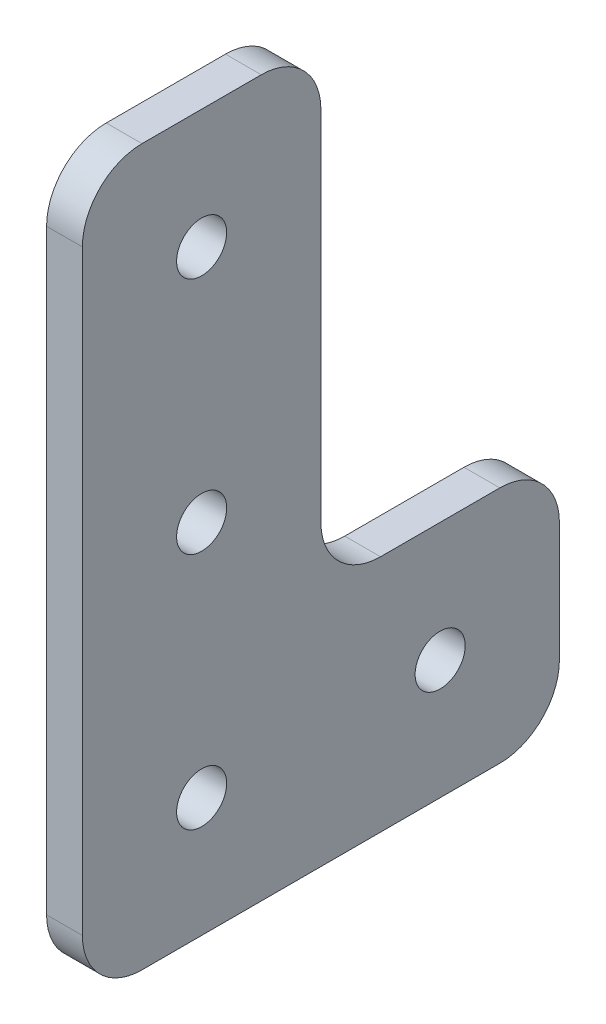
ISO-10303-21;
HEADER;
FILE_DESCRIPTION(('STEP AP214'),'2;1');
FILE_NAME('part.step','',(''),(''),'','','');
FILE_SCHEMA(('AUTOMOTIVE_DESIGN { 1 0 10303 214 1 1 1 1 }'));
ENDSEC;
DATA;
#1=APPLICATION_CONTEXT('core data for automotive mechanical design processes');
#2=APPLICATION_PROTOCOL_DEFINITION('international standard','automotive_design',2000,#1);
#3=PRODUCT_CONTEXT('',#1,'mechanical');
#4=PRODUCT('Part','Part','',(#3));
#5=PRODUCT_RELATED_PRODUCT_CATEGORY('part','',(#4));
#6=PRODUCT_DEFINITION_FORMATION('','',#4);
#7=PRODUCT_DEFINITION_CONTEXT('part definition',#1,'design');
#8=PRODUCT_DEFINITION('design','',#6,#7);
#9=PRODUCT_DEFINITION_SHAPE('','',#8);
#10=(LENGTH_UNIT() NAMED_UNIT(*) SI_UNIT(.MILLI.,.METRE.));
#11=(NAMED_UNIT(*) PLANE_ANGLE_UNIT() SI_UNIT($,.RADIAN.));
#12=(NAMED_UNIT(*) SI_UNIT($,.STERADIAN.) SOLID_ANGLE_UNIT());
#13=UNCERTAINTY_MEASURE_WITH_UNIT(LENGTH_MEASURE(1.E-05),#10,'distance_accuracy_value','');
#14=(GEOMETRIC_REPRESENTATION_CONTEXT(3) GLOBAL_UNCERTAINTY_ASSIGNED_CONTEXT((#13)) GLOBAL_UNIT_ASSIGNED_CONTEXT((#10,
#11,#12)) REPRESENTATION_CONTEXT('',''));
#15=CARTESIAN_POINT('',(0.,0.,0.));
#16=DIRECTION('',(0.,0.,1.));
#17=DIRECTION('',(1.,0.,0.));
#18=AXIS2_PLACEMENT_3D('',#15,#16,#17);
#19=CARTESIAN_POINT('',(3.,0.,0.));
#20=DIRECTION('',(1.,0.,0.));
#21=DIRECTION('',(0.,0.,-1.));
#22=AXIS2_PLACEMENT_3D('',#19,#20,#21);
#23=PLANE('',#22);
#24=CARTESIAN_POINT('',(3.,-20.,-4.18263190538858E-13));
#25=DIRECTION('',(1.,0.,0.));
#26=DIRECTION('',(0.,0.,-1.));
#27=AXIS2_PLACEMENT_3D('',#24,#25,#26);
#28=CIRCLE('',#27,2.1);
#29=CARTESIAN_POINT('',(3.,-20.,-2.10000000000042));
#30=VERTEX_POINT('',#29);
#31=EDGE_CURVE('E335',#30,#30,#28,.T.);
#32=ORIENTED_EDGE('',*,*,#31,.F.);
#33=EDGE_LOOP('',(#32));
#34=FACE_BOUND('',#33,.T.);
#35=CARTESIAN_POINT('',(3.,20.,0.));
#36=DIRECTION('',(1.,0.,0.));
#37=DIRECTION('',(0.,0.,-1.));
#38=AXIS2_PLACEMENT_3D('',#35,#36,#37);
#39=CIRCLE('',#38,2.1);
#40=CARTESIAN_POINT('',(3.,20.,-2.1));
#41=VERTEX_POINT('',#40);
#42=EDGE_CURVE('E269',#41,#41,#39,.T.);
#43=ORIENTED_EDGE('',*,*,#42,.F.);
#44=EDGE_LOOP('',(#43));
#45=FACE_BOUND('',#44,.T.);
#46=DIRECTION('',(0.,-1.,0.));
#47=VECTOR('',#46,1.);
#48=CARTESIAN_POINT('',(3.,30.,10.));
#49=LINE('',#48,#47);
#50=CARTESIAN_POINT('',(3.,25.,10.));
#51=VERTEX_POINT('',#50);
#52=CARTESIAN_POINT('',(3.,-25.,9.99999999999999));
#53=VERTEX_POINT('',#52);
#54=EDGE_CURVE('E171',#51,#53,#49,.T.);
#55=ORIENTED_EDGE('',*,*,#54,.T.);
#56=CARTESIAN_POINT('',(3.,-25.,5.));
#57=DIRECTION('',(1.,0.,0.));
#58=DIRECTION('',(0.,0.,-1.));
#59=AXIS2_PLACEMENT_3D('',#56,#57,#58);
#60=CIRCLE('',#59,5.);
#61=CARTESIAN_POINT('',(3.,-30.,5.));
#62=VERTEX_POINT('',#61);
#63=EDGE_CURVE('E199',#53,#62,#60,.T.);
#64=ORIENTED_EDGE('',*,*,#63,.T.);
#65=DIRECTION('',(0.,0.,-1.));
#66=VECTOR('',#65,1.);
#67=CARTESIAN_POINT('',(3.,-30.,-30.));
#68=LINE('',#67,#66);
#69=CARTESIAN_POINT('',(3.,-30.,-25.));
#70=VERTEX_POINT('',#69);
#71=EDGE_CURVE('E151',#62,#70,#68,.T.);
#72=ORIENTED_EDGE('',*,*,#71,.T.);
#73=CARTESIAN_POINT('',(3.,-25.,-25.));
#74=DIRECTION('',(1.,0.,0.));
#75=DIRECTION('',(0.,0.,-1.));
#76=AXIS2_PLACEMENT_3D('',#73,#74,#75);
#77=CIRCLE('',#76,5.);
#78=CARTESIAN_POINT('',(3.,-25.,-30.));
#79=VERTEX_POINT('',#78);
#80=EDGE_CURVE('E196',#70,#79,#77,.T.);
#81=ORIENTED_EDGE('',*,*,#80,.T.);
#82=DIRECTION('',(0.,1.,0.));
#83=VECTOR('',#82,1.);
#84=CARTESIAN_POINT('',(3.,-10.,-30.));
#85=LINE('',#84,#83);
#86=CARTESIAN_POINT('',(3.,-15.,-30.));
#87=VERTEX_POINT('',#86);
#88=EDGE_CURVE('E164',#79,#87,#85,.T.);
#89=ORIENTED_EDGE('',*,*,#88,.T.);
#90=CARTESIAN_POINT('',(3.,-15.,-25.));
#91=DIRECTION('',(1.,0.,0.));
#92=DIRECTION('',(0.,0.,-1.));
#93=AXIS2_PLACEMENT_3D('',#90,#91,#92);
#94=CIRCLE('',#93,5.);
#95=CARTESIAN_POINT('',(3.,-10.,-25.));
#96=VERTEX_POINT('',#95);
#97=EDGE_CURVE('E193',#87,#96,#94,.T.);
#98=ORIENTED_EDGE('',*,*,#97,.T.);
#99=DIRECTION('',(0.,0.,1.));
#100=VECTOR('',#99,1.);
#101=CARTESIAN_POINT('',(3.,-10.,-10.));
#102=LINE('',#101,#100);
#103=CARTESIAN_POINT('',(3.,-10.,-15.));
#104=VERTEX_POINT('',#103);
#105=EDGE_CURVE('E252',#96,#104,#102,.T.);
#106=ORIENTED_EDGE('',*,*,#105,.T.);
#107=CARTESIAN_POINT('',(3.,-5.,-15.));
#108=DIRECTION('',(1.,0.,0.));
#109=DIRECTION('',(0.,0.,-1.));
#110=AXIS2_PLACEMENT_3D('',#107,#108,#109);
#111=CIRCLE('',#110,5.);
#112=CARTESIAN_POINT('',(3.,-5.,-10.));
#113=VERTEX_POINT('',#112);
#114=EDGE_CURVE('E11',#104,#113,#111,.F.);
#115=ORIENTED_EDGE('',*,*,#114,.T.);
#116=DIRECTION('',(0.,1.,0.));
#117=VECTOR('',#116,1.);
#118=CARTESIAN_POINT('',(3.,30.,-10.));
#119=LINE('',#118,#117);
#120=CARTESIAN_POINT('',(3.,25.,-10.));
#121=VERTEX_POINT('',#120);
#122=EDGE_CURVE('E251',#113,#121,#119,.T.);
#123=ORIENTED_EDGE('',*,*,#122,.T.);
#124=CARTESIAN_POINT('',(3.,25.,-5.));
#125=DIRECTION('',(1.,0.,0.));
#126=DIRECTION('',(0.,0.,-1.));
#127=AXIS2_PLACEMENT_3D('',#124,#125,#126);
#128=CIRCLE('',#127,5.);
#129=CARTESIAN_POINT('',(3.,30.,-5.));
#130=VERTEX_POINT('',#129);
#131=EDGE_CURVE('E62',#121,#130,#128,.T.);
#132=ORIENTED_EDGE('',*,*,#131,.T.);
#133=DIRECTION('',(0.,0.,1.));
#134=VECTOR('',#133,1.);
#135=CARTESIAN_POINT('',(3.,30.,10.));
#136=LINE('',#135,#134);
#137=CARTESIAN_POINT('',(3.,30.,5.));
#138=VERTEX_POINT('',#137);
#139=EDGE_CURVE('E257',#130,#138,#136,.T.);
#140=ORIENTED_EDGE('',*,*,#139,.T.);
#141=CARTESIAN_POINT('',(3.,25.,5.));
#142=DIRECTION('',(1.,0.,0.));
#143=DIRECTION('',(0.,0.,-1.));
#144=AXIS2_PLACEMENT_3D('',#141,#142,#143);
#145=CIRCLE('',#144,5.);
#146=EDGE_CURVE('E188',#138,#51,#145,.T.);
#147=ORIENTED_EDGE('',*,*,#146,.T.);
#148=EDGE_LOOP('',(#55,#64,#72,#81,#89,#98,#106,#115,#123,#132,#140,#147));
#149=FACE_BOUND('',#148,.T.);
#150=CARTESIAN_POINT('',(3.,0.,-2.09998957007418E-13));
#151=DIRECTION('',(1.,0.,0.));
#152=DIRECTION('',(0.,0.,-1.));
#153=AXIS2_PLACEMENT_3D('',#150,#151,#152);
#154=CIRCLE('',#153,2.1);
#155=CARTESIAN_POINT('',(3.,0.,-2.10000000000021));
#156=VERTEX_POINT('',#155);
#157=EDGE_CURVE('E343',#156,#156,#154,.T.);
#158=ORIENTED_EDGE('',*,*,#157,.F.);
#159=EDGE_LOOP('',(#158));
#160=FACE_BOUND('',#159,.T.);
#161=CARTESIAN_POINT('',(3.,-20.,-20.0000000000004));
#162=DIRECTION('',(1.,0.,0.));
#163=DIRECTION('',(0.,0.,-1.));
#164=AXIS2_PLACEMENT_3D('',#161,#162,#163);
#165=CIRCLE('',#164,2.1);
#166=CARTESIAN_POINT('',(3.,-20.,-22.1000000000004));
#167=VERTEX_POINT('',#166);
#168=EDGE_CURVE('E324',#167,#167,#165,.T.);
#169=ORIENTED_EDGE('',*,*,#168,.F.);
#170=EDGE_LOOP('',(#169));
#171=FACE_BOUND('',#170,.T.);
#172=ADVANCED_FACE('F39',(#34,#45,#149,#160,#171),#23,.T.);
#173=CARTESIAN_POINT('',(0.,0.,0.));
#174=DIRECTION('',(1.,0.,0.));
#175=DIRECTION('',(0.,0.,-1.));
#176=AXIS2_PLACEMENT_3D('',#173,#174,#175);
#177=PLANE('',#176);
#178=DIRECTION('',(0.,0.,-1.));
#179=VECTOR('',#178,1.);
#180=CARTESIAN_POINT('',(0.,-30.,9.99999999999999));
#181=LINE('',#180,#179);
#182=CARTESIAN_POINT('',(0.,-30.,5.));
#183=VERTEX_POINT('',#182);
#184=CARTESIAN_POINT('',(0.,-30.,-25.));
#185=VERTEX_POINT('',#184);
#186=EDGE_CURVE('E148',#183,#185,#181,.T.);
#187=ORIENTED_EDGE('',*,*,#186,.F.);
#188=CARTESIAN_POINT('',(0.,-25.,5.));
#189=DIRECTION('',(1.,0.,0.));
#190=DIRECTION('',(0.,0.,-1.));
#191=AXIS2_PLACEMENT_3D('',#188,#189,#190);
#192=CIRCLE('',#191,5.);
#193=CARTESIAN_POINT('',(0.,-25.,9.99999999999999));
#194=VERTEX_POINT('',#193);
#195=EDGE_CURVE('E130',#183,#194,#192,.F.);
#196=ORIENTED_EDGE('',*,*,#195,.T.);
#197=DIRECTION('',(0.,-1.,0.));
#198=VECTOR('',#197,1.);
#199=CARTESIAN_POINT('',(0.,30.,10.));
#200=LINE('',#199,#198);
#201=CARTESIAN_POINT('',(0.,25.,10.));
#202=VERTEX_POINT('',#201);
#203=EDGE_CURVE('E160',#202,#194,#200,.T.);
#204=ORIENTED_EDGE('',*,*,#203,.F.);
#205=CARTESIAN_POINT('',(0.,25.,5.));
#206=DIRECTION('',(1.,0.,0.));
#207=DIRECTION('',(0.,0.,-1.));
#208=AXIS2_PLACEMENT_3D('',#205,#206,#207);
#209=CIRCLE('',#208,5.);
#210=CARTESIAN_POINT('',(0.,30.,5.));
#211=VERTEX_POINT('',#210);
#212=EDGE_CURVE('E153',#202,#211,#209,.F.);
#213=ORIENTED_EDGE('',*,*,#212,.T.);
#214=DIRECTION('',(0.,0.,1.));
#215=VECTOR('',#214,1.);
#216=CARTESIAN_POINT('',(0.,30.,10.));
#217=LINE('',#216,#215);
#218=CARTESIAN_POINT('',(0.,30.,-5.));
#219=VERTEX_POINT('',#218);
#220=EDGE_CURVE('E166',#219,#211,#217,.T.);
#221=ORIENTED_EDGE('',*,*,#220,.F.);
#222=CARTESIAN_POINT('',(0.,25.,-5.));
#223=DIRECTION('',(1.,0.,0.));
#224=DIRECTION('',(0.,0.,-1.));
#225=AXIS2_PLACEMENT_3D('',#222,#223,#224);
#226=CIRCLE('',#225,5.);
#227=CARTESIAN_POINT('',(0.,25.,-10.));
#228=VERTEX_POINT('',#227);
#229=EDGE_CURVE('E175',#219,#228,#226,.F.);
#230=ORIENTED_EDGE('',*,*,#229,.T.);
#231=DIRECTION('',(0.,1.,0.));
#232=VECTOR('',#231,1.);
#233=CARTESIAN_POINT('',(0.,30.,-10.));
#234=LINE('',#233,#232);
#235=CARTESIAN_POINT('',(0.,-5.,-10.));
#236=VERTEX_POINT('',#235);
#237=EDGE_CURVE('E234',#236,#228,#234,.T.);
#238=ORIENTED_EDGE('',*,*,#237,.F.);
#239=CARTESIAN_POINT('',(0.,-5.,-15.));
#240=DIRECTION('',(1.,0.,0.));
#241=DIRECTION('',(0.,0.,-1.));
#242=AXIS2_PLACEMENT_3D('',#239,#240,#241);
#243=CIRCLE('',#242,5.);
#244=CARTESIAN_POINT('',(0.,-10.,-15.));
#245=VERTEX_POINT('',#244);
#246=EDGE_CURVE('E48',#236,#245,#243,.T.);
#247=ORIENTED_EDGE('',*,*,#246,.T.);
#248=DIRECTION('',(0.,0.,1.));
#249=VECTOR('',#248,1.);
#250=CARTESIAN_POINT('',(0.,-10.,-10.));
#251=LINE('',#250,#249);
#252=CARTESIAN_POINT('',(0.,-10.,-25.));
#253=VERTEX_POINT('',#252);
#254=EDGE_CURVE('E232',#253,#245,#251,.T.);
#255=ORIENTED_EDGE('',*,*,#254,.F.);
#256=CARTESIAN_POINT('',(0.,-15.,-25.));
#257=DIRECTION('',(1.,0.,0.));
#258=DIRECTION('',(0.,0.,-1.));
#259=AXIS2_PLACEMENT_3D('',#256,#257,#258);
#260=CIRCLE('',#259,5.);
#261=CARTESIAN_POINT('',(0.,-15.,-30.));
#262=VERTEX_POINT('',#261);
#263=EDGE_CURVE('E178',#253,#262,#260,.F.);
#264=ORIENTED_EDGE('',*,*,#263,.T.);
#265=DIRECTION('',(0.,1.,0.));
#266=VECTOR('',#265,1.);
#267=CARTESIAN_POINT('',(0.,-10.,-30.));
#268=LINE('',#267,#266);
#269=CARTESIAN_POINT('',(0.,-25.,-30.));
#270=VERTEX_POINT('',#269);
#271=EDGE_CURVE('E244',#270,#262,#268,.T.);
#272=ORIENTED_EDGE('',*,*,#271,.F.);
#273=CARTESIAN_POINT('',(0.,-25.,-25.));
#274=DIRECTION('',(1.,0.,0.));
#275=DIRECTION('',(0.,0.,-1.));
#276=AXIS2_PLACEMENT_3D('',#273,#274,#275);
#277=CIRCLE('',#276,5.);
#278=EDGE_CURVE('E142',#270,#185,#277,.F.);
#279=ORIENTED_EDGE('',*,*,#278,.T.);
#280=EDGE_LOOP('',(#187,#196,#204,#213,#221,#230,#238,#247,#255,#264,#272,#279));
#281=FACE_BOUND('',#280,.T.);
#282=CARTESIAN_POINT('',(0.,20.,0.));
#283=DIRECTION('',(1.,0.,0.));
#284=DIRECTION('',(0.,0.,-1.));
#285=AXIS2_PLACEMENT_3D('',#282,#283,#284);
#286=CIRCLE('',#285,2.1);
#287=CARTESIAN_POINT('',(0.,20.,-2.1));
#288=VERTEX_POINT('',#287);
#289=EDGE_CURVE('E347',#288,#288,#286,.T.);
#290=ORIENTED_EDGE('',*,*,#289,.T.);
#291=EDGE_LOOP('',(#290));
#292=FACE_BOUND('',#291,.T.);
#293=CARTESIAN_POINT('',(0.,0.,-2.09998957007418E-13));
#294=DIRECTION('',(1.,0.,0.));
#295=DIRECTION('',(0.,0.,-1.));
#296=AXIS2_PLACEMENT_3D('',#293,#294,#295);
#297=CIRCLE('',#296,2.1);
#298=CARTESIAN_POINT('',(0.,0.,-2.10000000000021));
#299=VERTEX_POINT('',#298);
#300=EDGE_CURVE('E339',#299,#299,#297,.T.);
#301=ORIENTED_EDGE('',*,*,#300,.T.);
#302=EDGE_LOOP('',(#301));
#303=FACE_BOUND('',#302,.T.);
#304=CARTESIAN_POINT('',(0.,-20.,-4.18263190538858E-13));
#305=DIRECTION('',(1.,0.,0.));
#306=DIRECTION('',(0.,0.,-1.));
#307=AXIS2_PLACEMENT_3D('',#304,#305,#306);
#308=CIRCLE('',#307,2.1);
#309=CARTESIAN_POINT('',(0.,-20.,-2.10000000000042));
#310=VERTEX_POINT('',#309);
#311=EDGE_CURVE('E332',#310,#310,#308,.T.);
#312=ORIENTED_EDGE('',*,*,#311,.T.);
#313=EDGE_LOOP('',(#312));
#314=FACE_BOUND('',#313,.T.);
#315=CARTESIAN_POINT('',(0.,-20.,-20.0000000000004));
#316=DIRECTION('',(1.,0.,0.));
#317=DIRECTION('',(0.,0.,-1.));
#318=AXIS2_PLACEMENT_3D('',#315,#316,#317);
#319=CIRCLE('',#318,2.1);
#320=CARTESIAN_POINT('',(0.,-20.,-22.1000000000004));
#321=VERTEX_POINT('',#320);
#322=EDGE_CURVE('E327',#321,#321,#319,.T.);
#323=ORIENTED_EDGE('',*,*,#322,.T.);
#324=EDGE_LOOP('',(#323));
#325=FACE_BOUND('',#324,.T.);
#326=ADVANCED_FACE('F156',(#281,#292,#303,#314,#325),#177,.F.);
#327=CARTESIAN_POINT('',(3.,-10.,-30.));
#328=DIRECTION('',(0.,0.,1.));
#329=DIRECTION('',(0.,-1.,0.));
#330=AXIS2_PLACEMENT_3D('',#327,#328,#329);
#331=PLANE('',#330);
#332=ORIENTED_EDGE('',*,*,#88,.F.);
#333=DIRECTION('',(-1.,0.,0.));
#334=VECTOR('',#333,1.);
#335=CARTESIAN_POINT('',(3.,-25.,-30.));
#336=LINE('',#335,#334);
#337=EDGE_CURVE('E205',#79,#270,#336,.T.);
#338=ORIENTED_EDGE('',*,*,#337,.T.);
#339=ORIENTED_EDGE('',*,*,#271,.T.);
#340=DIRECTION('',(-1.,0.,0.));
#341=VECTOR('',#340,1.);
#342=CARTESIAN_POINT('',(3.,-15.,-30.));
#343=LINE('',#342,#341);
#344=EDGE_CURVE('E202',#262,#87,#343,.F.);
#345=ORIENTED_EDGE('',*,*,#344,.T.);
#346=EDGE_LOOP('',(#332,#338,#339,#345));
#347=FACE_BOUND('',#346,.T.);
#348=ADVANCED_FACE('F297',(#347),#331,.F.);
#349=CARTESIAN_POINT('',(3.,-10.,-10.));
#350=DIRECTION('',(0.,-1.,0.));
#351=DIRECTION('',(0.,0.,-1.));
#352=AXIS2_PLACEMENT_3D('',#349,#350,#351);
#353=PLANE('',#352);
#354=ORIENTED_EDGE('',*,*,#105,.F.);
#355=DIRECTION('',(-1.,0.,0.));
#356=VECTOR('',#355,1.);
#357=CARTESIAN_POINT('',(3.,-10.,-25.));
#358=LINE('',#357,#356);
#359=EDGE_CURVE('E212',#96,#253,#358,.T.);
#360=ORIENTED_EDGE('',*,*,#359,.T.);
#361=ORIENTED_EDGE('',*,*,#254,.T.);
#362=DIRECTION('',(-1.,0.,0.));
#363=VECTOR('',#362,1.);
#364=CARTESIAN_POINT('',(3.,-10.,-15.));
#365=LINE('',#364,#363);
#366=EDGE_CURVE('E209',#245,#104,#365,.F.);
#367=ORIENTED_EDGE('',*,*,#366,.T.);
#368=EDGE_LOOP('',(#354,#360,#361,#367));
#369=FACE_BOUND('',#368,.T.);
#370=ADVANCED_FACE('F240',(#369),#353,.F.);
#371=CARTESIAN_POINT('',(3.,30.,-10.));
#372=DIRECTION('',(0.,0.,1.));
#373=DIRECTION('',(0.,-1.,0.));
#374=AXIS2_PLACEMENT_3D('',#371,#372,#373);
#375=PLANE('',#374);
#376=ORIENTED_EDGE('',*,*,#122,.F.);
#377=DIRECTION('',(-1.,0.,0.));
#378=VECTOR('',#377,1.);
#379=CARTESIAN_POINT('',(0.,-5.,-10.));
#380=LINE('',#379,#378);
#381=EDGE_CURVE('E219',#113,#236,#380,.T.);
#382=ORIENTED_EDGE('',*,*,#381,.T.);
#383=ORIENTED_EDGE('',*,*,#237,.T.);
#384=DIRECTION('',(-1.,0.,0.));
#385=VECTOR('',#384,1.);
#386=CARTESIAN_POINT('',(3.,25.,-10.));
#387=LINE('',#386,#385);
#388=EDGE_CURVE('E216',#228,#121,#387,.F.);
#389=ORIENTED_EDGE('',*,*,#388,.T.);
#390=EDGE_LOOP('',(#376,#382,#383,#389));
#391=FACE_BOUND('',#390,.T.);
#392=ADVANCED_FACE('F254',(#391),#375,.F.);
#393=CARTESIAN_POINT('',(3.,30.,10.));
#394=DIRECTION('',(0.,-1.,0.));
#395=DIRECTION('',(0.,0.,-1.));
#396=AXIS2_PLACEMENT_3D('',#393,#394,#395);
#397=PLANE('',#396);
#398=ORIENTED_EDGE('',*,*,#139,.F.);
#399=DIRECTION('',(-1.,0.,0.));
#400=VECTOR('',#399,1.);
#401=CARTESIAN_POINT('',(3.,30.,-5.));
#402=LINE('',#401,#400);
#403=EDGE_CURVE('E225',#130,#219,#402,.T.);
#404=ORIENTED_EDGE('',*,*,#403,.T.);
#405=ORIENTED_EDGE('',*,*,#220,.T.);
#406=DIRECTION('',(-1.,0.,0.));
#407=VECTOR('',#406,1.);
#408=CARTESIAN_POINT('',(3.,30.,5.));
#409=LINE('',#408,#407);
#410=EDGE_CURVE('E55',#211,#138,#409,.F.);
#411=ORIENTED_EDGE('',*,*,#410,.T.);
#412=EDGE_LOOP('',(#398,#404,#405,#411));
#413=FACE_BOUND('',#412,.T.);
#414=ADVANCED_FACE('F274',(#413),#397,.F.);
#415=CARTESIAN_POINT('',(3.,30.,10.));
#416=DIRECTION('',(0.,0.,-1.));
#417=DIRECTION('',(0.,1.,0.));
#418=AXIS2_PLACEMENT_3D('',#415,#416,#417);
#419=PLANE('',#418);
#420=ORIENTED_EDGE('',*,*,#203,.T.);
#421=DIRECTION('',(-1.,0.,0.));
#422=VECTOR('',#421,1.);
#423=CARTESIAN_POINT('',(3.,-25.,9.99999999999999));
#424=LINE('',#423,#422);
#425=EDGE_CURVE('E135',#194,#53,#424,.F.);
#426=ORIENTED_EDGE('',*,*,#425,.T.);
#427=ORIENTED_EDGE('',*,*,#54,.F.);
#428=DIRECTION('',(-1.,0.,0.));
#429=VECTOR('',#428,1.);
#430=CARTESIAN_POINT('',(3.,25.,10.));
#431=LINE('',#430,#429);
#432=EDGE_CURVE('E141',#51,#202,#431,.T.);
#433=ORIENTED_EDGE('',*,*,#432,.T.);
#434=EDGE_LOOP('',(#420,#426,#427,#433));
#435=FACE_BOUND('',#434,.T.);
#436=ADVANCED_FACE('F281',(#435),#419,.F.);
#437=CARTESIAN_POINT('',(3.,-30.,9.99999999999999));
#438=DIRECTION('',(0.,1.,0.));
#439=DIRECTION('',(0.,0.,1.));
#440=AXIS2_PLACEMENT_3D('',#437,#438,#439);
#441=PLANE('',#440);
#442=ORIENTED_EDGE('',*,*,#71,.F.);
#443=DIRECTION('',(-1.,0.,0.));
#444=VECTOR('',#443,1.);
#445=CARTESIAN_POINT('',(3.,-30.,5.));
#446=LINE('',#445,#444);
#447=EDGE_CURVE('E134',#62,#183,#446,.T.);
#448=ORIENTED_EDGE('',*,*,#447,.T.);
#449=ORIENTED_EDGE('',*,*,#186,.T.);
#450=DIRECTION('',(-1.,0.,0.));
#451=VECTOR('',#450,1.);
#452=CARTESIAN_POINT('',(3.,-30.,-25.));
#453=LINE('',#452,#451);
#454=EDGE_CURVE('E154',#185,#70,#453,.F.);
#455=ORIENTED_EDGE('',*,*,#454,.T.);
#456=EDGE_LOOP('',(#442,#448,#449,#455));
#457=FACE_BOUND('',#456,.T.);
#458=ADVANCED_FACE('F147',(#457),#441,.F.);
#459=CARTESIAN_POINT('',(3.,20.,0.));
#460=DIRECTION('',(-1.,0.,0.));
#461=DIRECTION('',(0.,0.,1.));
#462=AXIS2_PLACEMENT_3D('',#459,#460,#461);
#463=CYLINDRICAL_SURFACE('',#462,2.1);
#464=ORIENTED_EDGE('',*,*,#42,.T.);
#465=EDGE_LOOP('',(#464));
#466=FACE_BOUND('',#465,.T.);
#467=ORIENTED_EDGE('',*,*,#289,.F.);
#468=EDGE_LOOP('',(#467));
#469=FACE_BOUND('',#468,.T.);
#470=ADVANCED_FACE('F288',(#466,#469),#463,.F.);
#471=CARTESIAN_POINT('',(3.,0.,-2.09998957007418E-13));
#472=DIRECTION('',(-1.,0.,0.));
#473=DIRECTION('',(0.,0.,1.));
#474=AXIS2_PLACEMENT_3D('',#471,#472,#473);
#475=CYLINDRICAL_SURFACE('',#474,2.1);
#476=ORIENTED_EDGE('',*,*,#157,.T.);
#477=EDGE_LOOP('',(#476));
#478=FACE_BOUND('',#477,.T.);
#479=ORIENTED_EDGE('',*,*,#300,.F.);
#480=EDGE_LOOP('',(#479));
#481=FACE_BOUND('',#480,.T.);
#482=ADVANCED_FACE('F304',(#478,#481),#475,.F.);
#483=CARTESIAN_POINT('',(3.,-20.,-4.18263190538858E-13));
#484=DIRECTION('',(-1.,0.,0.));
#485=DIRECTION('',(0.,0.,1.));
#486=AXIS2_PLACEMENT_3D('',#483,#484,#485);
#487=CYLINDRICAL_SURFACE('',#486,2.1);
#488=ORIENTED_EDGE('',*,*,#31,.T.);
#489=EDGE_LOOP('',(#488));
#490=FACE_BOUND('',#489,.T.);
#491=ORIENTED_EDGE('',*,*,#311,.F.);
#492=EDGE_LOOP('',(#491));
#493=FACE_BOUND('',#492,.T.);
#494=ADVANCED_FACE('F308',(#490,#493),#487,.F.);
#495=CARTESIAN_POINT('',(3.,-20.,-20.0000000000004));
#496=DIRECTION('',(-1.,0.,0.));
#497=DIRECTION('',(0.,0.,1.));
#498=AXIS2_PLACEMENT_3D('',#495,#496,#497);
#499=CYLINDRICAL_SURFACE('',#498,2.1);
#500=ORIENTED_EDGE('',*,*,#168,.T.);
#501=EDGE_LOOP('',(#500));
#502=FACE_BOUND('',#501,.T.);
#503=ORIENTED_EDGE('',*,*,#322,.F.);
#504=EDGE_LOOP('',(#503));
#505=FACE_BOUND('',#504,.T.);
#506=ADVANCED_FACE('F312',(#502,#505),#499,.F.);
#507=CARTESIAN_POINT('',(3.,-25.,5.));
#508=DIRECTION('',(-1.,0.,0.));
#509=DIRECTION('',(0.,0.,1.));
#510=AXIS2_PLACEMENT_3D('',#507,#508,#509);
#511=CYLINDRICAL_SURFACE('',#510,5.);
#512=ORIENTED_EDGE('',*,*,#63,.F.);
#513=ORIENTED_EDGE('',*,*,#425,.F.);
#514=ORIENTED_EDGE('',*,*,#195,.F.);
#515=ORIENTED_EDGE('',*,*,#447,.F.);
#516=EDGE_LOOP('',(#512,#513,#514,#515));
#517=FACE_BOUND('',#516,.T.);
#518=ADVANCED_FACE('F133',(#517),#511,.T.);
#519=CARTESIAN_POINT('',(3.,-25.,-25.));
#520=DIRECTION('',(-1.,0.,0.));
#521=DIRECTION('',(0.,0.,1.));
#522=AXIS2_PLACEMENT_3D('',#519,#520,#521);
#523=CYLINDRICAL_SURFACE('',#522,5.);
#524=ORIENTED_EDGE('',*,*,#80,.F.);
#525=ORIENTED_EDGE('',*,*,#454,.F.);
#526=ORIENTED_EDGE('',*,*,#278,.F.);
#527=ORIENTED_EDGE('',*,*,#337,.F.);
#528=EDGE_LOOP('',(#524,#525,#526,#527));
#529=FACE_BOUND('',#528,.T.);
#530=ADVANCED_FACE('F319',(#529),#523,.T.);
#531=CARTESIAN_POINT('',(3.,-15.,-25.));
#532=DIRECTION('',(-1.,0.,0.));
#533=DIRECTION('',(0.,0.,1.));
#534=AXIS2_PLACEMENT_3D('',#531,#532,#533);
#535=CYLINDRICAL_SURFACE('',#534,5.);
#536=ORIENTED_EDGE('',*,*,#97,.F.);
#537=ORIENTED_EDGE('',*,*,#344,.F.);
#538=ORIENTED_EDGE('',*,*,#263,.F.);
#539=ORIENTED_EDGE('',*,*,#359,.F.);
#540=EDGE_LOOP('',(#536,#537,#538,#539));
#541=FACE_BOUND('',#540,.T.);
#542=ADVANCED_FACE('F365',(#541),#535,.T.);
#543=CARTESIAN_POINT('',(3.,-5.,-15.));
#544=DIRECTION('',(1.,0.,0.));
#545=DIRECTION('',(0.,0.,-1.));
#546=AXIS2_PLACEMENT_3D('',#543,#544,#545);
#547=CYLINDRICAL_SURFACE('',#546,5.);
#548=ORIENTED_EDGE('',*,*,#114,.F.);
#549=ORIENTED_EDGE('',*,*,#366,.F.);
#550=ORIENTED_EDGE('',*,*,#246,.F.);
#551=ORIENTED_EDGE('',*,*,#381,.F.);
#552=EDGE_LOOP('',(#548,#549,#550,#551));
#553=FACE_BOUND('',#552,.T.);
#554=ADVANCED_FACE('F247',(#553),#547,.F.);
#555=CARTESIAN_POINT('',(3.,25.,-5.));
#556=DIRECTION('',(-1.,0.,0.));
#557=DIRECTION('',(0.,0.,1.));
#558=AXIS2_PLACEMENT_3D('',#555,#556,#557);
#559=CYLINDRICAL_SURFACE('',#558,5.);
#560=ORIENTED_EDGE('',*,*,#131,.F.);
#561=ORIENTED_EDGE('',*,*,#388,.F.);
#562=ORIENTED_EDGE('',*,*,#229,.F.);
#563=ORIENTED_EDGE('',*,*,#403,.F.);
#564=EDGE_LOOP('',(#560,#561,#562,#563));
#565=FACE_BOUND('',#564,.T.);
#566=ADVANCED_FACE('F376',(#565),#559,.T.);
#567=CARTESIAN_POINT('',(3.,25.,5.));
#568=DIRECTION('',(-1.,0.,0.));
#569=DIRECTION('',(0.,0.,1.));
#570=AXIS2_PLACEMENT_3D('',#567,#568,#569);
#571=CYLINDRICAL_SURFACE('',#570,5.);
#572=ORIENTED_EDGE('',*,*,#146,.F.);
#573=ORIENTED_EDGE('',*,*,#410,.F.);
#574=ORIENTED_EDGE('',*,*,#212,.F.);
#575=ORIENTED_EDGE('',*,*,#432,.F.);
#576=EDGE_LOOP('',(#572,#573,#574,#575));
#577=FACE_BOUND('',#576,.T.);
#578=ADVANCED_FACE('F41',(#577),#571,.T.);
#579=CLOSED_SHELL('',(#172,#326,#348,#370,#392,#414,#436,#458,#470,#482,#494,#506,#518,#530,
#542,#554,#566,#578));
#580=MANIFOLD_SOLID_BREP('B2',#579);
#581=ADVANCED_BREP_SHAPE_REPRESENTATION('',(#18,#580),#14);
#582=SHAPE_DEFINITION_REPRESENTATION(#9,#581);
ENDSEC;
END-ISO-10303-21;
